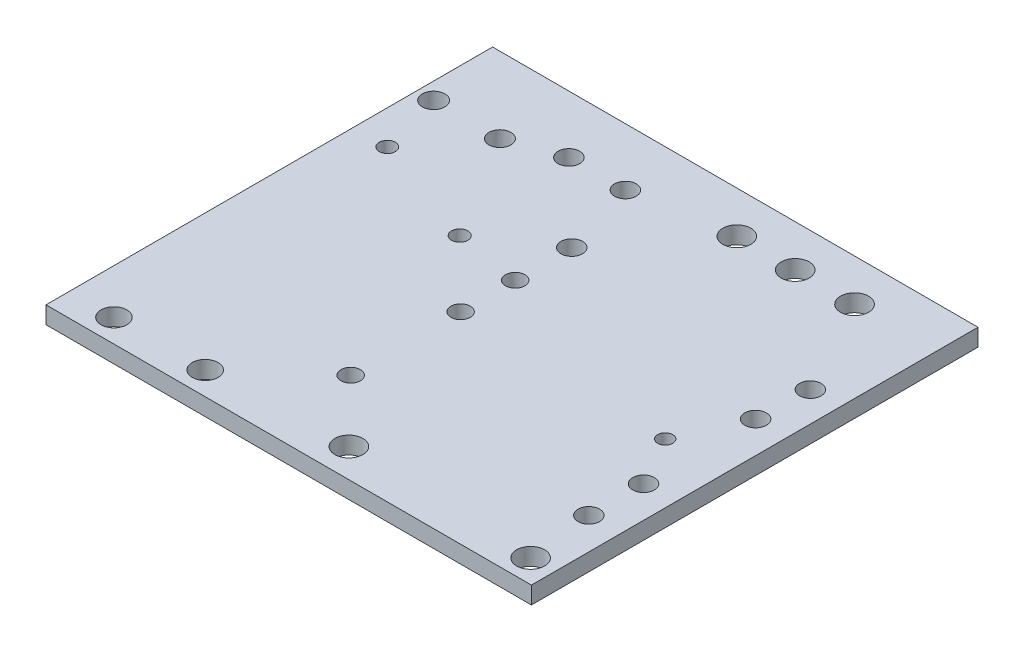
ISO-10303-21;
HEADER;
FILE_DESCRIPTION(('STEP AP214'),'2;1');
FILE_NAME('part.step','',(''),(''),'','','');
FILE_SCHEMA(('AUTOMOTIVE_DESIGN { 1 0 10303 214 1 1 1 1 }'));
ENDSEC;
DATA;
#1=APPLICATION_CONTEXT('core data for automotive mechanical design processes');
#2=APPLICATION_PROTOCOL_DEFINITION('international standard','automotive_design',2000,#1);
#3=PRODUCT_CONTEXT('',#1,'mechanical');
#4=PRODUCT('Part','Part','',(#3));
#5=PRODUCT_RELATED_PRODUCT_CATEGORY('part','',(#4));
#6=PRODUCT_DEFINITION_FORMATION('','',#4);
#7=PRODUCT_DEFINITION_CONTEXT('part definition',#1,'design');
#8=PRODUCT_DEFINITION('design','',#6,#7);
#9=PRODUCT_DEFINITION_SHAPE('','',#8);
#10=(LENGTH_UNIT() NAMED_UNIT(*) SI_UNIT(.MILLI.,.METRE.));
#11=(NAMED_UNIT(*) PLANE_ANGLE_UNIT() SI_UNIT($,.RADIAN.));
#12=(NAMED_UNIT(*) SI_UNIT($,.STERADIAN.) SOLID_ANGLE_UNIT());
#13=UNCERTAINTY_MEASURE_WITH_UNIT(LENGTH_MEASURE(1.E-05),#10,'distance_accuracy_value','');
#14=(GEOMETRIC_REPRESENTATION_CONTEXT(3) GLOBAL_UNCERTAINTY_ASSIGNED_CONTEXT((#13)) GLOBAL_UNIT_ASSIGNED_CONTEXT((#10,
#11,#12)) REPRESENTATION_CONTEXT('',''));
#15=CARTESIAN_POINT('',(0.,0.,0.));
#16=DIRECTION('',(0.,0.,1.));
#17=DIRECTION('',(1.,0.,0.));
#18=AXIS2_PLACEMENT_3D('',#15,#16,#17);
#19=CARTESIAN_POINT('',(11.25,0.8,10.35));
#20=DIRECTION('',(-1.,0.,0.));
#21=DIRECTION('',(0.,0.,1.));
#22=AXIS2_PLACEMENT_3D('',#19,#20,#21);
#23=PLANE('',#22);
#24=DIRECTION('',(0.,0.,-1.));
#25=VECTOR('',#24,1.);
#26=CARTESIAN_POINT('',(11.25,0.,10.35));
#27=LINE('',#26,#25);
#28=CARTESIAN_POINT('',(11.25,0.,10.35));
#29=VERTEX_POINT('',#28);
#30=CARTESIAN_POINT('',(11.25,0.,-10.35));
#31=VERTEX_POINT('',#30);
#32=EDGE_CURVE('E102',#29,#31,#27,.T.);
#33=ORIENTED_EDGE('',*,*,#32,.T.);
#34=DIRECTION('',(0.,-1.,0.));
#35=VECTOR('',#34,1.);
#36=CARTESIAN_POINT('',(11.25,0.8,-10.35));
#37=LINE('',#36,#35);
#38=CARTESIAN_POINT('',(11.25,0.8,-10.35));
#39=VERTEX_POINT('',#38);
#40=EDGE_CURVE('E11',#39,#31,#37,.T.);
#41=ORIENTED_EDGE('',*,*,#40,.F.);
#42=DIRECTION('',(0.,0.,-1.));
#43=VECTOR('',#42,1.);
#44=CARTESIAN_POINT('',(11.25,0.8,10.35));
#45=LINE('',#44,#43);
#46=CARTESIAN_POINT('',(11.25,0.8,10.35));
#47=VERTEX_POINT('',#46);
#48=EDGE_CURVE('E89',#47,#39,#45,.T.);
#49=ORIENTED_EDGE('',*,*,#48,.F.);
#50=DIRECTION('',(0.,-1.,0.));
#51=VECTOR('',#50,1.);
#52=CARTESIAN_POINT('',(11.25,0.8,10.35));
#53=LINE('',#52,#51);
#54=EDGE_CURVE('E98',#47,#29,#53,.T.);
#55=ORIENTED_EDGE('',*,*,#54,.T.);
#56=EDGE_LOOP('',(#33,#41,#49,#55));
#57=FACE_BOUND('',#56,.T.);
#58=ADVANCED_FACE('F36',(#57),#23,.F.);
#59=CARTESIAN_POINT('',(-11.25,0.8,-10.35));
#60=DIRECTION('',(0.,0.,1.));
#61=DIRECTION('',(1.,0.,0.));
#62=AXIS2_PLACEMENT_3D('',#59,#60,#61);
#63=PLANE('',#62);
#64=DIRECTION('',(-1.,0.,0.));
#65=VECTOR('',#64,1.);
#66=CARTESIAN_POINT('',(-11.25,0.,-10.35));
#67=LINE('',#66,#65);
#68=CARTESIAN_POINT('',(-11.25,0.,-10.35));
#69=VERTEX_POINT('',#68);
#70=EDGE_CURVE('E93',#31,#69,#67,.T.);
#71=ORIENTED_EDGE('',*,*,#70,.T.);
#72=DIRECTION('',(0.,-1.,0.));
#73=VECTOR('',#72,1.);
#74=CARTESIAN_POINT('',(-11.25,0.8,-10.35));
#75=LINE('',#74,#73);
#76=CARTESIAN_POINT('',(-11.25,0.8,-10.35));
#77=VERTEX_POINT('',#76);
#78=EDGE_CURVE('E45',#77,#69,#75,.T.);
#79=ORIENTED_EDGE('',*,*,#78,.F.);
#80=DIRECTION('',(-1.,0.,0.));
#81=VECTOR('',#80,1.);
#82=CARTESIAN_POINT('',(-11.25,0.8,-10.35));
#83=LINE('',#82,#81);
#84=EDGE_CURVE('E84',#39,#77,#83,.T.);
#85=ORIENTED_EDGE('',*,*,#84,.F.);
#86=ORIENTED_EDGE('',*,*,#40,.T.);
#87=EDGE_LOOP('',(#71,#79,#85,#86));
#88=FACE_BOUND('',#87,.T.);
#89=ADVANCED_FACE('F92',(#88),#63,.F.);
#90=CARTESIAN_POINT('',(-11.25,0.8,10.35));
#91=DIRECTION('',(1.,0.,0.));
#92=DIRECTION('',(0.,0.,-1.));
#93=AXIS2_PLACEMENT_3D('',#90,#91,#92);
#94=PLANE('',#93);
#95=DIRECTION('',(0.,0.,1.));
#96=VECTOR('',#95,1.);
#97=CARTESIAN_POINT('',(-11.25,0.,10.35));
#98=LINE('',#97,#96);
#99=CARTESIAN_POINT('',(-11.25,0.,10.35));
#100=VERTEX_POINT('',#99);
#101=EDGE_CURVE('E71',#69,#100,#98,.T.);
#102=ORIENTED_EDGE('',*,*,#101,.T.);
#103=DIRECTION('',(0.,-1.,0.));
#104=VECTOR('',#103,1.);
#105=CARTESIAN_POINT('',(-11.25,0.8,10.35));
#106=LINE('',#105,#104);
#107=CARTESIAN_POINT('',(-11.25,0.8,10.35));
#108=VERTEX_POINT('',#107);
#109=EDGE_CURVE('E94',#108,#100,#106,.T.);
#110=ORIENTED_EDGE('',*,*,#109,.F.);
#111=DIRECTION('',(0.,0.,1.));
#112=VECTOR('',#111,1.);
#113=CARTESIAN_POINT('',(-11.25,0.8,10.35));
#114=LINE('',#113,#112);
#115=EDGE_CURVE('E87',#77,#108,#114,.T.);
#116=ORIENTED_EDGE('',*,*,#115,.F.);
#117=ORIENTED_EDGE('',*,*,#78,.T.);
#118=EDGE_LOOP('',(#102,#110,#116,#117));
#119=FACE_BOUND('',#118,.T.);
#120=ADVANCED_FACE('F96',(#119),#94,.F.);
#121=CARTESIAN_POINT('',(-11.25,0.8,10.35));
#122=DIRECTION('',(0.,0.,-1.));
#123=DIRECTION('',(-1.,0.,0.));
#124=AXIS2_PLACEMENT_3D('',#121,#122,#123);
#125=PLANE('',#124);
#126=DIRECTION('',(1.,0.,0.));
#127=VECTOR('',#126,1.);
#128=CARTESIAN_POINT('',(-11.25,0.,10.35));
#129=LINE('',#128,#127);
#130=EDGE_CURVE('E77',#100,#29,#129,.T.);
#131=ORIENTED_EDGE('',*,*,#130,.T.);
#132=ORIENTED_EDGE('',*,*,#54,.F.);
#133=DIRECTION('',(1.,0.,0.));
#134=VECTOR('',#133,1.);
#135=CARTESIAN_POINT('',(-11.25,0.8,10.35));
#136=LINE('',#135,#134);
#137=EDGE_CURVE('E54',#108,#47,#136,.T.);
#138=ORIENTED_EDGE('',*,*,#137,.F.);
#139=ORIENTED_EDGE('',*,*,#109,.T.);
#140=EDGE_LOOP('',(#131,#132,#138,#139));
#141=FACE_BOUND('',#140,.T.);
#142=ADVANCED_FACE('F247',(#141),#125,.F.);
#143=CARTESIAN_POINT('',(11.25,0.8,-10.35));
#144=DIRECTION('',(0.,-1.,0.));
#145=DIRECTION('',(0.,0.,-1.));
#146=AXIS2_PLACEMENT_3D('',#143,#144,#145);
#147=PLANE('',#146);
#148=CARTESIAN_POINT('',(-10.4732064370183,0.8,-6.84022388522041));
#149=DIRECTION('',(0.,1.,0.));
#150=DIRECTION('',(0.,0.,1.));
#151=AXIS2_PLACEMENT_3D('',#148,#149,#150);
#152=CIRCLE('',#151,0.522974081322831);
#153=CARTESIAN_POINT('',(-10.4732064370183,0.8,-6.31724980389758));
#154=VERTEX_POINT('',#153);
#155=EDGE_CURVE('E201',#154,#154,#152,.T.);
#156=ORIENTED_EDGE('',*,*,#155,.F.);
#157=EDGE_LOOP('',(#156));
#158=FACE_BOUND('',#157,.T.);
#159=CARTESIAN_POINT('',(8.4856740845613,0.8,1.38409855189605));
#160=DIRECTION('',(0.,1.,0.));
#161=DIRECTION('',(0.,0.,1.));
#162=AXIS2_PLACEMENT_3D('',#159,#160,#161);
#163=CIRCLE('',#162,0.350015613233293);
#164=CARTESIAN_POINT('',(8.4856740845613,0.8,1.73411416512934));
#165=VERTEX_POINT('',#164);
#166=EDGE_CURVE('E191',#165,#165,#163,.T.);
#167=ORIENTED_EDGE('',*,*,#166,.F.);
#168=EDGE_LOOP('',(#167));
#169=FACE_BOUND('',#168,.T.);
#170=CARTESIAN_POINT('',(-4.44144338362008,0.8,-2.0176093511858));
#171=DIRECTION('',(0.,1.,0.));
#172=DIRECTION('',(0.,0.,1.));
#173=AXIS2_PLACEMENT_3D('',#170,#171,#172);
#174=CIRCLE('',#173,0.378805018342111);
#175=CARTESIAN_POINT('',(-4.44144338362008,0.8,-1.63880433284368));
#176=VERTEX_POINT('',#175);
#177=EDGE_CURVE('E188',#176,#176,#174,.T.);
#178=ORIENTED_EDGE('',*,*,#177,.F.);
#179=EDGE_LOOP('',(#178));
#180=FACE_BOUND('',#179,.T.);
#181=CARTESIAN_POINT('',(-9.67793946449817,0.8,-3.89695244413638));
#182=DIRECTION('',(0.,1.,0.));
#183=DIRECTION('',(0.,0.,1.));
#184=AXIS2_PLACEMENT_3D('',#181,#182,#183);
#185=CIRCLE('',#184,0.375708804748963);
#186=CARTESIAN_POINT('',(-9.67793946449817,0.8,-3.52124363938742));
#187=VERTEX_POINT('',#186);
#188=EDGE_CURVE('E185',#187,#187,#185,.T.);
#189=ORIENTED_EDGE('',*,*,#188,.F.);
#190=EDGE_LOOP('',(#189));
#191=FACE_BOUND('',#190,.T.);
#192=CARTESIAN_POINT('',(-4.94565562891905,0.8,9.27688136240454));
#193=DIRECTION('',(0.,1.,0.));
#194=DIRECTION('',(0.,0.,1.));
#195=AXIS2_PLACEMENT_3D('',#192,#193,#194);
#196=CIRCLE('',#195,0.6);
#197=CARTESIAN_POINT('',(-4.94565562891905,0.8,9.87688136240454));
#198=VERTEX_POINT('',#197);
#199=EDGE_CURVE('E181',#198,#198,#196,.T.);
#200=ORIENTED_EDGE('',*,*,#199,.F.);
#201=EDGE_LOOP('',(#200));
#202=FACE_BOUND('',#201,.T.);
#203=CARTESIAN_POINT('',(-9.17319454829377,0.8,9.27688136240454));
#204=DIRECTION('',(0.,1.,0.));
#205=DIRECTION('',(0.,0.,1.));
#206=AXIS2_PLACEMENT_3D('',#203,#204,#205);
#207=CIRCLE('',#206,0.6);
#208=CARTESIAN_POINT('',(-9.17319454829377,0.8,9.87688136240454));
#209=VERTEX_POINT('',#208);
#210=EDGE_CURVE('E177',#209,#209,#207,.T.);
#211=ORIENTED_EDGE('',*,*,#210,.F.);
#212=EDGE_LOOP('',(#211));
#213=FACE_BOUND('',#212,.T.);
#214=CARTESIAN_POINT('',(-7.40057526025794,0.8,-6.84022388522041));
#215=DIRECTION('',(0.,1.,0.));
#216=DIRECTION('',(0.,0.,1.));
#217=AXIS2_PLACEMENT_3D('',#214,#215,#216);
#218=CIRCLE('',#217,0.507049463910012);
#219=CARTESIAN_POINT('',(-7.40057526025794,0.8,-6.3331744213104));
#220=VERTEX_POINT('',#219);
#221=EDGE_CURVE('E173',#220,#220,#218,.T.);
#222=ORIENTED_EDGE('',*,*,#221,.F.);
#223=EDGE_LOOP('',(#222));
#224=FACE_BOUND('',#223,.T.);
#225=CARTESIAN_POINT('',(7.46451211684841,0.8,-8.41282710997643));
#226=DIRECTION('',(0.,1.,0.));
#227=DIRECTION('',(0.,0.,1.));
#228=AXIS2_PLACEMENT_3D('',#225,#226,#227);
#229=CIRCLE('',#228,0.65);
#230=CARTESIAN_POINT('',(7.46451211684841,0.8,-7.76282710997643));
#231=VERTEX_POINT('',#230);
#232=EDGE_CURVE('E169',#231,#231,#229,.T.);
#233=ORIENTED_EDGE('',*,*,#232,.F.);
#234=EDGE_LOOP('',(#233));
#235=FACE_BOUND('',#234,.T.);
#236=CARTESIAN_POINT('',(4.71344683180445,0.8,-8.41282710997643));
#237=DIRECTION('',(0.,1.,0.));
#238=DIRECTION('',(0.,0.,1.));
#239=AXIS2_PLACEMENT_3D('',#236,#237,#238);
#240=CIRCLE('',#239,0.65);
#241=CARTESIAN_POINT('',(4.71344683180445,0.8,-7.76282710997643));
#242=VERTEX_POINT('',#241);
#243=EDGE_CURVE('E165',#242,#242,#240,.T.);
#244=ORIENTED_EDGE('',*,*,#243,.F.);
#245=EDGE_LOOP('',(#244));
#246=FACE_BOUND('',#245,.T.);
#247=CARTESIAN_POINT('',(2.00981370684746,0.8,-8.41282710997643));
#248=DIRECTION('',(0.,1.,0.));
#249=DIRECTION('',(0.,0.,1.));
#250=AXIS2_PLACEMENT_3D('',#247,#248,#249);
#251=CIRCLE('',#250,0.65);
#252=CARTESIAN_POINT('',(2.00981370684746,0.8,-7.76282710997643));
#253=VERTEX_POINT('',#252);
#254=EDGE_CURVE('E161',#253,#253,#251,.T.);
#255=ORIENTED_EDGE('',*,*,#254,.F.);
#256=EDGE_LOOP('',(#255));
#257=FACE_BOUND('',#256,.T.);
#258=CARTESIAN_POINT('',(-1.36249742269812,0.8,1.01875027100488));
#259=DIRECTION('',(0.,1.,0.));
#260=DIRECTION('',(0.,0.,1.));
#261=AXIS2_PLACEMENT_3D('',#258,#259,#260);
#262=CIRCLE('',#261,0.45);
#263=CARTESIAN_POINT('',(-1.36249742269812,0.8,1.46875027100488));
#264=VERTEX_POINT('',#263);
#265=EDGE_CURVE('E157',#264,#264,#262,.T.);
#266=ORIENTED_EDGE('',*,*,#265,.F.);
#267=EDGE_LOOP('',(#266));
#268=FACE_BOUND('',#267,.T.);
#269=CARTESIAN_POINT('',(-1.36249742269812,0.8,-1.51017465891394));
#270=DIRECTION('',(0.,1.,0.));
#271=DIRECTION('',(0.,0.,1.));
#272=AXIS2_PLACEMENT_3D('',#269,#270,#271);
#273=CIRCLE('',#272,0.45);
#274=CARTESIAN_POINT('',(-1.36249742269812,0.8,-1.06017465891394));
#275=VERTEX_POINT('',#274);
#276=EDGE_CURVE('E153',#275,#275,#273,.T.);
#277=ORIENTED_EDGE('',*,*,#276,.F.);
#278=EDGE_LOOP('',(#277));
#279=FACE_BOUND('',#278,.T.);
#280=CARTESIAN_POINT('',(9.86830054840113,0.8,-3.96095459609984));
#281=DIRECTION('',(0.,1.,0.));
#282=DIRECTION('',(0.,0.,1.));
#283=AXIS2_PLACEMENT_3D('',#280,#281,#282);
#284=CIRCLE('',#283,0.500000000000001);
#285=CARTESIAN_POINT('',(9.86830054840113,0.8,-3.46095459609984));
#286=VERTEX_POINT('',#285);
#287=EDGE_CURVE('E149',#286,#286,#284,.T.);
#288=ORIENTED_EDGE('',*,*,#287,.F.);
#289=EDGE_LOOP('',(#288));
#290=FACE_BOUND('',#289,.T.);
#291=CARTESIAN_POINT('',(-1.36249742269812,0.8,6.11397672923984));
#292=DIRECTION('',(0.,1.,0.));
#293=DIRECTION('',(0.,0.,1.));
#294=AXIS2_PLACEMENT_3D('',#291,#292,#293);
#295=CIRCLE('',#294,0.45);
#296=CARTESIAN_POINT('',(-1.36249742269812,0.8,6.56397672923984));
#297=VERTEX_POINT('',#296);
#298=EDGE_CURVE('E145',#297,#297,#295,.T.);
#299=ORIENTED_EDGE('',*,*,#298,.F.);
#300=EDGE_LOOP('',(#299));
#301=FACE_BOUND('',#300,.T.);
#302=CARTESIAN_POINT('',(-2.42991794487146,0.8,-7.68432392844592));
#303=DIRECTION('',(0.,1.,0.));
#304=DIRECTION('',(0.,0.,1.));
#305=AXIS2_PLACEMENT_3D('',#302,#303,#304);
#306=CIRCLE('',#305,0.500000000000001);
#307=CARTESIAN_POINT('',(-2.42991794487146,0.8,-7.18432392844592));
#308=VERTEX_POINT('',#307);
#309=EDGE_CURVE('E141',#308,#308,#306,.T.);
#310=ORIENTED_EDGE('',*,*,#309,.F.);
#311=EDGE_LOOP('',(#310));
#312=FACE_BOUND('',#311,.T.);
#313=CARTESIAN_POINT('',(-5.04905004636665,0.8,-7.68432392844592));
#314=DIRECTION('',(0.,1.,0.));
#315=DIRECTION('',(0.,0.,1.));
#316=AXIS2_PLACEMENT_3D('',#313,#314,#315);
#317=CIRCLE('',#316,0.500000000000001);
#318=CARTESIAN_POINT('',(-5.04905004636665,0.8,-7.18432392844592));
#319=VERTEX_POINT('',#318);
#320=EDGE_CURVE('E137',#319,#319,#317,.T.);
#321=ORIENTED_EDGE('',*,*,#320,.F.);
#322=EDGE_LOOP('',(#321));
#323=FACE_BOUND('',#322,.T.);
#324=CARTESIAN_POINT('',(1.45647824505554,0.8,9.01844096568845));
#325=DIRECTION('',(0.,1.,0.));
#326=DIRECTION('',(0.,0.,1.));
#327=AXIS2_PLACEMENT_3D('',#324,#325,#326);
#328=CIRCLE('',#327,0.65);
#329=CARTESIAN_POINT('',(1.45647824505554,0.8,9.66844096568845));
#330=VERTEX_POINT('',#329);
#331=EDGE_CURVE('E133',#330,#330,#328,.T.);
#332=ORIENTED_EDGE('',*,*,#331,.F.);
#333=EDGE_LOOP('',(#332));
#334=FACE_BOUND('',#333,.T.);
#335=CARTESIAN_POINT('',(10.140573186622,0.8,9.27688136240454));
#336=DIRECTION('',(0.,1.,0.));
#337=DIRECTION('',(0.,0.,1.));
#338=AXIS2_PLACEMENT_3D('',#335,#336,#337);
#339=CIRCLE('',#338,0.649999999999999);
#340=CARTESIAN_POINT('',(10.140573186622,0.8,9.92688136240454));
#341=VERTEX_POINT('',#340);
#342=EDGE_CURVE('E129',#341,#341,#339,.T.);
#343=ORIENTED_EDGE('',*,*,#342,.F.);
#344=EDGE_LOOP('',(#343));
#345=FACE_BOUND('',#344,.T.);
#346=CARTESIAN_POINT('',(9.7819644312939,0.8,6.22038171359918));
#347=DIRECTION('',(0.,1.,0.));
#348=DIRECTION('',(0.,0.,1.));
#349=AXIS2_PLACEMENT_3D('',#346,#347,#348);
#350=CIRCLE('',#349,0.500000000000001);
#351=CARTESIAN_POINT('',(9.7819644312939,0.8,6.72038171359918));
#352=VERTEX_POINT('',#351);
#353=EDGE_CURVE('E125',#352,#352,#350,.T.);
#354=ORIENTED_EDGE('',*,*,#353,.F.);
#355=EDGE_LOOP('',(#354));
#356=FACE_BOUND('',#355,.T.);
#357=CARTESIAN_POINT('',(9.7819644312939,0.8,3.68441086293057));
#358=DIRECTION('',(0.,1.,0.));
#359=DIRECTION('',(0.,0.,1.));
#360=AXIS2_PLACEMENT_3D('',#357,#358,#359);
#361=CIRCLE('',#360,0.500000000000001);
#362=CARTESIAN_POINT('',(9.7819644312939,0.8,4.18441086293057));
#363=VERTEX_POINT('',#362);
#364=EDGE_CURVE('E121',#363,#363,#361,.T.);
#365=ORIENTED_EDGE('',*,*,#364,.F.);
#366=EDGE_LOOP('',(#365));
#367=FACE_BOUND('',#366,.T.);
#368=CARTESIAN_POINT('',(9.7819644312939,0.8,-1.51017465891394));
#369=DIRECTION('',(0.,1.,0.));
#370=DIRECTION('',(0.,0.,1.));
#371=AXIS2_PLACEMENT_3D('',#368,#369,#370);
#372=CIRCLE('',#371,0.500000000000001);
#373=CARTESIAN_POINT('',(9.7819644312939,0.8,-1.01017465891394));
#374=VERTEX_POINT('',#373);
#375=EDGE_CURVE('E117',#374,#374,#372,.T.);
#376=ORIENTED_EDGE('',*,*,#375,.F.);
#377=EDGE_LOOP('',(#376));
#378=FACE_BOUND('',#377,.T.);
#379=CARTESIAN_POINT('',(-1.36249742269812,0.8,-4.13217588978839));
#380=DIRECTION('',(0.,1.,0.));
#381=DIRECTION('',(0.,0.,1.));
#382=AXIS2_PLACEMENT_3D('',#379,#380,#381);
#383=CIRCLE('',#382,0.500000000000001);
#384=CARTESIAN_POINT('',(-1.36249742269812,0.8,-3.63217588978839));
#385=VERTEX_POINT('',#384);
#386=EDGE_CURVE('E113',#385,#385,#383,.T.);
#387=ORIENTED_EDGE('',*,*,#386,.F.);
#388=EDGE_LOOP('',(#387));
#389=FACE_BOUND('',#388,.T.);
#390=ORIENTED_EDGE('',*,*,#48,.T.);
#391=ORIENTED_EDGE('',*,*,#84,.T.);
#392=ORIENTED_EDGE('',*,*,#115,.T.);
#393=ORIENTED_EDGE('',*,*,#137,.T.);
#394=EDGE_LOOP('',(#390,#391,#392,#393));
#395=FACE_BOUND('',#394,.T.);
#396=ADVANCED_FACE('F85',(#158,#169,#180,#191,#202,#213,#224,#235,#246,#257,#268,#279,#290,#301,
#312,#323,#334,#345,#356,#367,#378,#389,#395),#147,.F.);
#397=CARTESIAN_POINT('',(11.25,0.,-10.35));
#398=DIRECTION('',(0.,-1.,0.));
#399=DIRECTION('',(0.,0.,-1.));
#400=AXIS2_PLACEMENT_3D('',#397,#398,#399);
#401=PLANE('',#400);
#402=CARTESIAN_POINT('',(-10.4732064370183,0.,-6.84022388522041));
#403=DIRECTION('',(0.,-1.,0.));
#404=DIRECTION('',(0.,0.,-1.));
#405=AXIS2_PLACEMENT_3D('',#402,#403,#404);
#406=CIRCLE('',#405,0.522974081322831);
#407=CARTESIAN_POINT('',(-10.4732064370183,0.,-7.36319796654324));
#408=VERTEX_POINT('',#407);
#409=EDGE_CURVE('E39',#408,#408,#406,.T.);
#410=ORIENTED_EDGE('',*,*,#409,.F.);
#411=EDGE_LOOP('',(#410));
#412=FACE_BOUND('',#411,.T.);
#413=CARTESIAN_POINT('',(8.4856740845613,0.,1.38409855189605));
#414=DIRECTION('',(0.,-1.,0.));
#415=DIRECTION('',(0.,0.,-1.));
#416=AXIS2_PLACEMENT_3D('',#413,#414,#415);
#417=CIRCLE('',#416,0.350015613233293);
#418=CARTESIAN_POINT('',(8.4856740845613,0.,1.03408293866276));
#419=VERTEX_POINT('',#418);
#420=EDGE_CURVE('E189',#419,#419,#417,.T.);
#421=ORIENTED_EDGE('',*,*,#420,.F.);
#422=EDGE_LOOP('',(#421));
#423=FACE_BOUND('',#422,.T.);
#424=CARTESIAN_POINT('',(-4.44144338362008,0.,-2.0176093511858));
#425=DIRECTION('',(0.,-1.,0.));
#426=DIRECTION('',(0.,0.,-1.));
#427=AXIS2_PLACEMENT_3D('',#424,#425,#426);
#428=CIRCLE('',#427,0.378805018342111);
#429=CARTESIAN_POINT('',(-4.44144338362008,0.,-2.39641436952791));
#430=VERTEX_POINT('',#429);
#431=EDGE_CURVE('E186',#430,#430,#428,.T.);
#432=ORIENTED_EDGE('',*,*,#431,.F.);
#433=EDGE_LOOP('',(#432));
#434=FACE_BOUND('',#433,.T.);
#435=CARTESIAN_POINT('',(-9.67793946449817,0.,-3.89695244413638));
#436=DIRECTION('',(0.,-1.,0.));
#437=DIRECTION('',(0.,0.,-1.));
#438=AXIS2_PLACEMENT_3D('',#435,#436,#437);
#439=CIRCLE('',#438,0.375708804748963);
#440=CARTESIAN_POINT('',(-9.67793946449817,0.,-4.27266124888535));
#441=VERTEX_POINT('',#440);
#442=EDGE_CURVE('E182',#441,#441,#439,.T.);
#443=ORIENTED_EDGE('',*,*,#442,.F.);
#444=EDGE_LOOP('',(#443));
#445=FACE_BOUND('',#444,.T.);
#446=CARTESIAN_POINT('',(-4.94565562891905,0.,9.27688136240454));
#447=DIRECTION('',(0.,-1.,0.));
#448=DIRECTION('',(0.,0.,-1.));
#449=AXIS2_PLACEMENT_3D('',#446,#447,#448);
#450=CIRCLE('',#449,0.6);
#451=CARTESIAN_POINT('',(-4.94565562891905,0.,8.67688136240455));
#452=VERTEX_POINT('',#451);
#453=EDGE_CURVE('E178',#452,#452,#450,.T.);
#454=ORIENTED_EDGE('',*,*,#453,.F.);
#455=EDGE_LOOP('',(#454));
#456=FACE_BOUND('',#455,.T.);
#457=CARTESIAN_POINT('',(-9.17319454829377,0.,9.27688136240454));
#458=DIRECTION('',(0.,-1.,0.));
#459=DIRECTION('',(0.,0.,-1.));
#460=AXIS2_PLACEMENT_3D('',#457,#458,#459);
#461=CIRCLE('',#460,0.6);
#462=CARTESIAN_POINT('',(-9.17319454829377,0.,8.67688136240455));
#463=VERTEX_POINT('',#462);
#464=EDGE_CURVE('E174',#463,#463,#461,.T.);
#465=ORIENTED_EDGE('',*,*,#464,.F.);
#466=EDGE_LOOP('',(#465));
#467=FACE_BOUND('',#466,.T.);
#468=CARTESIAN_POINT('',(-7.40057526025794,0.,-6.84022388522041));
#469=DIRECTION('',(0.,-1.,0.));
#470=DIRECTION('',(0.,0.,-1.));
#471=AXIS2_PLACEMENT_3D('',#468,#469,#470);
#472=CIRCLE('',#471,0.507049463910012);
#473=CARTESIAN_POINT('',(-7.40057526025794,0.,-7.34727334913042));
#474=VERTEX_POINT('',#473);
#475=EDGE_CURVE('E170',#474,#474,#472,.T.);
#476=ORIENTED_EDGE('',*,*,#475,.F.);
#477=EDGE_LOOP('',(#476));
#478=FACE_BOUND('',#477,.T.);
#479=CARTESIAN_POINT('',(7.46451211684841,0.,-8.41282710997643));
#480=DIRECTION('',(0.,-1.,0.));
#481=DIRECTION('',(0.,0.,-1.));
#482=AXIS2_PLACEMENT_3D('',#479,#480,#481);
#483=CIRCLE('',#482,0.65);
#484=CARTESIAN_POINT('',(7.46451211684841,0.,-9.06282710997643));
#485=VERTEX_POINT('',#484);
#486=EDGE_CURVE('E166',#485,#485,#483,.T.);
#487=ORIENTED_EDGE('',*,*,#486,.F.);
#488=EDGE_LOOP('',(#487));
#489=FACE_BOUND('',#488,.T.);
#490=CARTESIAN_POINT('',(4.71344683180445,0.,-8.41282710997643));
#491=DIRECTION('',(0.,-1.,0.));
#492=DIRECTION('',(0.,0.,-1.));
#493=AXIS2_PLACEMENT_3D('',#490,#491,#492);
#494=CIRCLE('',#493,0.65);
#495=CARTESIAN_POINT('',(4.71344683180445,0.,-9.06282710997643));
#496=VERTEX_POINT('',#495);
#497=EDGE_CURVE('E162',#496,#496,#494,.T.);
#498=ORIENTED_EDGE('',*,*,#497,.F.);
#499=EDGE_LOOP('',(#498));
#500=FACE_BOUND('',#499,.T.);
#501=CARTESIAN_POINT('',(2.00981370684746,0.,-8.41282710997643));
#502=DIRECTION('',(0.,-1.,0.));
#503=DIRECTION('',(0.,0.,-1.));
#504=AXIS2_PLACEMENT_3D('',#501,#502,#503);
#505=CIRCLE('',#504,0.65);
#506=CARTESIAN_POINT('',(2.00981370684746,0.,-9.06282710997643));
#507=VERTEX_POINT('',#506);
#508=EDGE_CURVE('E158',#507,#507,#505,.T.);
#509=ORIENTED_EDGE('',*,*,#508,.F.);
#510=EDGE_LOOP('',(#509));
#511=FACE_BOUND('',#510,.T.);
#512=CARTESIAN_POINT('',(-1.36249742269812,0.,1.01875027100488));
#513=DIRECTION('',(0.,-1.,0.));
#514=DIRECTION('',(0.,0.,-1.));
#515=AXIS2_PLACEMENT_3D('',#512,#513,#514);
#516=CIRCLE('',#515,0.45);
#517=CARTESIAN_POINT('',(-1.36249742269812,0.,0.568750271004883));
#518=VERTEX_POINT('',#517);
#519=EDGE_CURVE('E154',#518,#518,#516,.T.);
#520=ORIENTED_EDGE('',*,*,#519,.F.);
#521=EDGE_LOOP('',(#520));
#522=FACE_BOUND('',#521,.T.);
#523=CARTESIAN_POINT('',(-1.36249742269812,0.,-1.51017465891394));
#524=DIRECTION('',(0.,-1.,0.));
#525=DIRECTION('',(0.,0.,-1.));
#526=AXIS2_PLACEMENT_3D('',#523,#524,#525);
#527=CIRCLE('',#526,0.45);
#528=CARTESIAN_POINT('',(-1.36249742269812,0.,-1.96017465891394));
#529=VERTEX_POINT('',#528);
#530=EDGE_CURVE('E150',#529,#529,#527,.T.);
#531=ORIENTED_EDGE('',*,*,#530,.F.);
#532=EDGE_LOOP('',(#531));
#533=FACE_BOUND('',#532,.T.);
#534=CARTESIAN_POINT('',(9.86830054840113,0.,-3.96095459609984));
#535=DIRECTION('',(0.,-1.,0.));
#536=DIRECTION('',(0.,0.,-1.));
#537=AXIS2_PLACEMENT_3D('',#534,#535,#536);
#538=CIRCLE('',#537,0.500000000000001);
#539=CARTESIAN_POINT('',(9.86830054840113,0.,-4.46095459609984));
#540=VERTEX_POINT('',#539);
#541=EDGE_CURVE('E146',#540,#540,#538,.T.);
#542=ORIENTED_EDGE('',*,*,#541,.F.);
#543=EDGE_LOOP('',(#542));
#544=FACE_BOUND('',#543,.T.);
#545=CARTESIAN_POINT('',(-1.36249742269812,0.,6.11397672923984));
#546=DIRECTION('',(0.,-1.,0.));
#547=DIRECTION('',(0.,0.,-1.));
#548=AXIS2_PLACEMENT_3D('',#545,#546,#547);
#549=CIRCLE('',#548,0.45);
#550=CARTESIAN_POINT('',(-1.36249742269812,0.,5.66397672923984));
#551=VERTEX_POINT('',#550);
#552=EDGE_CURVE('E142',#551,#551,#549,.T.);
#553=ORIENTED_EDGE('',*,*,#552,.F.);
#554=EDGE_LOOP('',(#553));
#555=FACE_BOUND('',#554,.T.);
#556=CARTESIAN_POINT('',(-2.42991794487146,0.,-7.68432392844592));
#557=DIRECTION('',(0.,-1.,0.));
#558=DIRECTION('',(0.,0.,-1.));
#559=AXIS2_PLACEMENT_3D('',#556,#557,#558);
#560=CIRCLE('',#559,0.500000000000001);
#561=CARTESIAN_POINT('',(-2.42991794487146,0.,-8.18432392844592));
#562=VERTEX_POINT('',#561);
#563=EDGE_CURVE('E138',#562,#562,#560,.T.);
#564=ORIENTED_EDGE('',*,*,#563,.F.);
#565=EDGE_LOOP('',(#564));
#566=FACE_BOUND('',#565,.T.);
#567=CARTESIAN_POINT('',(-5.04905004636665,0.,-7.68432392844592));
#568=DIRECTION('',(0.,-1.,0.));
#569=DIRECTION('',(0.,0.,-1.));
#570=AXIS2_PLACEMENT_3D('',#567,#568,#569);
#571=CIRCLE('',#570,0.500000000000001);
#572=CARTESIAN_POINT('',(-5.04905004636665,0.,-8.18432392844592));
#573=VERTEX_POINT('',#572);
#574=EDGE_CURVE('E134',#573,#573,#571,.T.);
#575=ORIENTED_EDGE('',*,*,#574,.F.);
#576=EDGE_LOOP('',(#575));
#577=FACE_BOUND('',#576,.T.);
#578=CARTESIAN_POINT('',(1.45647824505554,0.,9.01844096568845));
#579=DIRECTION('',(0.,-1.,0.));
#580=DIRECTION('',(0.,0.,-1.));
#581=AXIS2_PLACEMENT_3D('',#578,#579,#580);
#582=CIRCLE('',#581,0.65);
#583=CARTESIAN_POINT('',(1.45647824505554,0.,8.36844096568845));
#584=VERTEX_POINT('',#583);
#585=EDGE_CURVE('E130',#584,#584,#582,.T.);
#586=ORIENTED_EDGE('',*,*,#585,.F.);
#587=EDGE_LOOP('',(#586));
#588=FACE_BOUND('',#587,.T.);
#589=CARTESIAN_POINT('',(10.140573186622,0.,9.27688136240454));
#590=DIRECTION('',(0.,-1.,0.));
#591=DIRECTION('',(0.,0.,-1.));
#592=AXIS2_PLACEMENT_3D('',#589,#590,#591);
#593=CIRCLE('',#592,0.649999999999999);
#594=CARTESIAN_POINT('',(10.140573186622,0.,8.62688136240454));
#595=VERTEX_POINT('',#594);
#596=EDGE_CURVE('E126',#595,#595,#593,.T.);
#597=ORIENTED_EDGE('',*,*,#596,.F.);
#598=EDGE_LOOP('',(#597));
#599=FACE_BOUND('',#598,.T.);
#600=CARTESIAN_POINT('',(9.7819644312939,0.,6.22038171359918));
#601=DIRECTION('',(0.,-1.,0.));
#602=DIRECTION('',(0.,0.,-1.));
#603=AXIS2_PLACEMENT_3D('',#600,#601,#602);
#604=CIRCLE('',#603,0.500000000000001);
#605=CARTESIAN_POINT('',(9.7819644312939,0.,5.72038171359918));
#606=VERTEX_POINT('',#605);
#607=EDGE_CURVE('E122',#606,#606,#604,.T.);
#608=ORIENTED_EDGE('',*,*,#607,.F.);
#609=EDGE_LOOP('',(#608));
#610=FACE_BOUND('',#609,.T.);
#611=CARTESIAN_POINT('',(9.7819644312939,0.,3.68441086293057));
#612=DIRECTION('',(0.,-1.,0.));
#613=DIRECTION('',(0.,0.,-1.));
#614=AXIS2_PLACEMENT_3D('',#611,#612,#613);
#615=CIRCLE('',#614,0.500000000000001);
#616=CARTESIAN_POINT('',(9.7819644312939,0.,3.18441086293057));
#617=VERTEX_POINT('',#616);
#618=EDGE_CURVE('E118',#617,#617,#615,.T.);
#619=ORIENTED_EDGE('',*,*,#618,.F.);
#620=EDGE_LOOP('',(#619));
#621=FACE_BOUND('',#620,.T.);
#622=CARTESIAN_POINT('',(9.7819644312939,0.,-1.51017465891394));
#623=DIRECTION('',(0.,-1.,0.));
#624=DIRECTION('',(0.,0.,-1.));
#625=AXIS2_PLACEMENT_3D('',#622,#623,#624);
#626=CIRCLE('',#625,0.500000000000001);
#627=CARTESIAN_POINT('',(9.7819644312939,0.,-2.01017465891394));
#628=VERTEX_POINT('',#627);
#629=EDGE_CURVE('E114',#628,#628,#626,.T.);
#630=ORIENTED_EDGE('',*,*,#629,.F.);
#631=EDGE_LOOP('',(#630));
#632=FACE_BOUND('',#631,.T.);
#633=CARTESIAN_POINT('',(-1.36249742269812,0.,-4.13217588978839));
#634=DIRECTION('',(0.,-1.,0.));
#635=DIRECTION('',(0.,0.,-1.));
#636=AXIS2_PLACEMENT_3D('',#633,#634,#635);
#637=CIRCLE('',#636,0.500000000000001);
#638=CARTESIAN_POINT('',(-1.36249742269812,0.,-4.63217588978839));
#639=VERTEX_POINT('',#638);
#640=EDGE_CURVE('E105',#639,#639,#637,.T.);
#641=ORIENTED_EDGE('',*,*,#640,.F.);
#642=EDGE_LOOP('',(#641));
#643=FACE_BOUND('',#642,.T.);
#644=ORIENTED_EDGE('',*,*,#32,.F.);
#645=ORIENTED_EDGE('',*,*,#130,.F.);
#646=ORIENTED_EDGE('',*,*,#101,.F.);
#647=ORIENTED_EDGE('',*,*,#70,.F.);
#648=EDGE_LOOP('',(#644,#645,#646,#647));
#649=FACE_BOUND('',#648,.T.);
#650=ADVANCED_FACE('F246',(#412,#423,#434,#445,#456,#467,#478,#489,#500,#511,#522,#533,#544,
#555,#566,#577,#588,#599,#610,#621,#632,#643,#649),#401,.T.);
#651=CARTESIAN_POINT('',(-1.36249742269812,-1.2,-4.13217588978839));
#652=DIRECTION('',(0.,1.,0.));
#653=DIRECTION('',(0.,0.,1.));
#654=AXIS2_PLACEMENT_3D('',#651,#652,#653);
#655=CYLINDRICAL_SURFACE('',#654,0.500000000000001);
#656=ORIENTED_EDGE('',*,*,#640,.T.);
#657=EDGE_LOOP('',(#656));
#658=FACE_BOUND('',#657,.T.);
#659=ORIENTED_EDGE('',*,*,#386,.T.);
#660=EDGE_LOOP('',(#659));
#661=FACE_BOUND('',#660,.T.);
#662=ADVANCED_FACE('F243',(#658,#661),#655,.F.);
#663=CARTESIAN_POINT('',(9.7819644312939,-1.2,-1.51017465891394));
#664=DIRECTION('',(0.,1.,0.));
#665=DIRECTION('',(0.,0.,1.));
#666=AXIS2_PLACEMENT_3D('',#663,#664,#665);
#667=CYLINDRICAL_SURFACE('',#666,0.500000000000001);
#668=ORIENTED_EDGE('',*,*,#629,.T.);
#669=EDGE_LOOP('',(#668));
#670=FACE_BOUND('',#669,.T.);
#671=ORIENTED_EDGE('',*,*,#375,.T.);
#672=EDGE_LOOP('',(#671));
#673=FACE_BOUND('',#672,.T.);
#674=ADVANCED_FACE('F299',(#670,#673),#667,.F.);
#675=CARTESIAN_POINT('',(9.7819644312939,-1.2,3.68441086293057));
#676=DIRECTION('',(0.,1.,0.));
#677=DIRECTION('',(0.,0.,1.));
#678=AXIS2_PLACEMENT_3D('',#675,#676,#677);
#679=CYLINDRICAL_SURFACE('',#678,0.500000000000001);
#680=ORIENTED_EDGE('',*,*,#618,.T.);
#681=EDGE_LOOP('',(#680));
#682=FACE_BOUND('',#681,.T.);
#683=ORIENTED_EDGE('',*,*,#364,.T.);
#684=EDGE_LOOP('',(#683));
#685=FACE_BOUND('',#684,.T.);
#686=ADVANCED_FACE('F308',(#682,#685),#679,.F.);
#687=CARTESIAN_POINT('',(9.7819644312939,-1.2,6.22038171359918));
#688=DIRECTION('',(0.,1.,0.));
#689=DIRECTION('',(0.,0.,1.));
#690=AXIS2_PLACEMENT_3D('',#687,#688,#689);
#691=CYLINDRICAL_SURFACE('',#690,0.500000000000001);
#692=ORIENTED_EDGE('',*,*,#607,.T.);
#693=EDGE_LOOP('',(#692));
#694=FACE_BOUND('',#693,.T.);
#695=ORIENTED_EDGE('',*,*,#353,.T.);
#696=EDGE_LOOP('',(#695));
#697=FACE_BOUND('',#696,.T.);
#698=ADVANCED_FACE('F318',(#694,#697),#691,.F.);
#699=CARTESIAN_POINT('',(10.140573186622,-1.2,9.27688136240454));
#700=DIRECTION('',(0.,1.,0.));
#701=DIRECTION('',(0.,0.,1.));
#702=AXIS2_PLACEMENT_3D('',#699,#700,#701);
#703=CYLINDRICAL_SURFACE('',#702,0.649999999999999);
#704=ORIENTED_EDGE('',*,*,#596,.T.);
#705=EDGE_LOOP('',(#704));
#706=FACE_BOUND('',#705,.T.);
#707=ORIENTED_EDGE('',*,*,#342,.T.);
#708=EDGE_LOOP('',(#707));
#709=FACE_BOUND('',#708,.T.);
#710=ADVANCED_FACE('F328',(#706,#709),#703,.F.);
#711=CARTESIAN_POINT('',(1.45647824505554,-1.2,9.01844096568845));
#712=DIRECTION('',(0.,1.,0.));
#713=DIRECTION('',(0.,0.,1.));
#714=AXIS2_PLACEMENT_3D('',#711,#712,#713);
#715=CYLINDRICAL_SURFACE('',#714,0.65);
#716=ORIENTED_EDGE('',*,*,#585,.T.);
#717=EDGE_LOOP('',(#716));
#718=FACE_BOUND('',#717,.T.);
#719=ORIENTED_EDGE('',*,*,#331,.T.);
#720=EDGE_LOOP('',(#719));
#721=FACE_BOUND('',#720,.T.);
#722=ADVANCED_FACE('F338',(#718,#721),#715,.F.);
#723=CARTESIAN_POINT('',(-5.04905004636665,-1.2,-7.68432392844592));
#724=DIRECTION('',(0.,1.,0.));
#725=DIRECTION('',(0.,0.,1.));
#726=AXIS2_PLACEMENT_3D('',#723,#724,#725);
#727=CYLINDRICAL_SURFACE('',#726,0.500000000000001);
#728=ORIENTED_EDGE('',*,*,#574,.T.);
#729=EDGE_LOOP('',(#728));
#730=FACE_BOUND('',#729,.T.);
#731=ORIENTED_EDGE('',*,*,#320,.T.);
#732=EDGE_LOOP('',(#731));
#733=FACE_BOUND('',#732,.T.);
#734=ADVANCED_FACE('F348',(#730,#733),#727,.F.);
#735=CARTESIAN_POINT('',(-2.42991794487146,-1.2,-7.68432392844592));
#736=DIRECTION('',(0.,1.,0.));
#737=DIRECTION('',(0.,0.,1.));
#738=AXIS2_PLACEMENT_3D('',#735,#736,#737);
#739=CYLINDRICAL_SURFACE('',#738,0.500000000000001);
#740=ORIENTED_EDGE('',*,*,#563,.T.);
#741=EDGE_LOOP('',(#740));
#742=FACE_BOUND('',#741,.T.);
#743=ORIENTED_EDGE('',*,*,#309,.T.);
#744=EDGE_LOOP('',(#743));
#745=FACE_BOUND('',#744,.T.);
#746=ADVANCED_FACE('F358',(#742,#745),#739,.F.);
#747=CARTESIAN_POINT('',(-1.36249742269812,-1.2,6.11397672923984));
#748=DIRECTION('',(0.,1.,0.));
#749=DIRECTION('',(0.,0.,1.));
#750=AXIS2_PLACEMENT_3D('',#747,#748,#749);
#751=CYLINDRICAL_SURFACE('',#750,0.45);
#752=ORIENTED_EDGE('',*,*,#552,.T.);
#753=EDGE_LOOP('',(#752));
#754=FACE_BOUND('',#753,.T.);
#755=ORIENTED_EDGE('',*,*,#298,.T.);
#756=EDGE_LOOP('',(#755));
#757=FACE_BOUND('',#756,.T.);
#758=ADVANCED_FACE('F368',(#754,#757),#751,.F.);
#759=CARTESIAN_POINT('',(9.86830054840113,-1.2,-3.96095459609984));
#760=DIRECTION('',(0.,1.,0.));
#761=DIRECTION('',(0.,0.,1.));
#762=AXIS2_PLACEMENT_3D('',#759,#760,#761);
#763=CYLINDRICAL_SURFACE('',#762,0.500000000000001);
#764=ORIENTED_EDGE('',*,*,#541,.T.);
#765=EDGE_LOOP('',(#764));
#766=FACE_BOUND('',#765,.T.);
#767=ORIENTED_EDGE('',*,*,#287,.T.);
#768=EDGE_LOOP('',(#767));
#769=FACE_BOUND('',#768,.T.);
#770=ADVANCED_FACE('F378',(#766,#769),#763,.F.);
#771=CARTESIAN_POINT('',(-1.36249742269812,-1.2,-1.51017465891394));
#772=DIRECTION('',(0.,1.,0.));
#773=DIRECTION('',(0.,0.,1.));
#774=AXIS2_PLACEMENT_3D('',#771,#772,#773);
#775=CYLINDRICAL_SURFACE('',#774,0.45);
#776=ORIENTED_EDGE('',*,*,#530,.T.);
#777=EDGE_LOOP('',(#776));
#778=FACE_BOUND('',#777,.T.);
#779=ORIENTED_EDGE('',*,*,#276,.T.);
#780=EDGE_LOOP('',(#779));
#781=FACE_BOUND('',#780,.T.);
#782=ADVANCED_FACE('F388',(#778,#781),#775,.F.);
#783=CARTESIAN_POINT('',(-1.36249742269812,-1.2,1.01875027100488));
#784=DIRECTION('',(0.,1.,0.));
#785=DIRECTION('',(0.,0.,1.));
#786=AXIS2_PLACEMENT_3D('',#783,#784,#785);
#787=CYLINDRICAL_SURFACE('',#786,0.45);
#788=ORIENTED_EDGE('',*,*,#519,.T.);
#789=EDGE_LOOP('',(#788));
#790=FACE_BOUND('',#789,.T.);
#791=ORIENTED_EDGE('',*,*,#265,.T.);
#792=EDGE_LOOP('',(#791));
#793=FACE_BOUND('',#792,.T.);
#794=ADVANCED_FACE('F398',(#790,#793),#787,.F.);
#795=CARTESIAN_POINT('',(2.00981370684746,-1.2,-8.41282710997643));
#796=DIRECTION('',(0.,1.,0.));
#797=DIRECTION('',(0.,0.,1.));
#798=AXIS2_PLACEMENT_3D('',#795,#796,#797);
#799=CYLINDRICAL_SURFACE('',#798,0.65);
#800=ORIENTED_EDGE('',*,*,#508,.T.);
#801=EDGE_LOOP('',(#800));
#802=FACE_BOUND('',#801,.T.);
#803=ORIENTED_EDGE('',*,*,#254,.T.);
#804=EDGE_LOOP('',(#803));
#805=FACE_BOUND('',#804,.T.);
#806=ADVANCED_FACE('F408',(#802,#805),#799,.F.);
#807=CARTESIAN_POINT('',(4.71344683180445,-1.2,-8.41282710997643));
#808=DIRECTION('',(0.,1.,0.));
#809=DIRECTION('',(0.,0.,1.));
#810=AXIS2_PLACEMENT_3D('',#807,#808,#809);
#811=CYLINDRICAL_SURFACE('',#810,0.65);
#812=ORIENTED_EDGE('',*,*,#497,.T.);
#813=EDGE_LOOP('',(#812));
#814=FACE_BOUND('',#813,.T.);
#815=ORIENTED_EDGE('',*,*,#243,.T.);
#816=EDGE_LOOP('',(#815));
#817=FACE_BOUND('',#816,.T.);
#818=ADVANCED_FACE('F418',(#814,#817),#811,.F.);
#819=CARTESIAN_POINT('',(7.46451211684841,-1.2,-8.41282710997643));
#820=DIRECTION('',(0.,1.,0.));
#821=DIRECTION('',(0.,0.,1.));
#822=AXIS2_PLACEMENT_3D('',#819,#820,#821);
#823=CYLINDRICAL_SURFACE('',#822,0.65);
#824=ORIENTED_EDGE('',*,*,#486,.T.);
#825=EDGE_LOOP('',(#824));
#826=FACE_BOUND('',#825,.T.);
#827=ORIENTED_EDGE('',*,*,#232,.T.);
#828=EDGE_LOOP('',(#827));
#829=FACE_BOUND('',#828,.T.);
#830=ADVANCED_FACE('F428',(#826,#829),#823,.F.);
#831=CARTESIAN_POINT('',(-7.40057526025794,-1.2,-6.84022388522041));
#832=DIRECTION('',(0.,1.,0.));
#833=DIRECTION('',(0.,0.,1.));
#834=AXIS2_PLACEMENT_3D('',#831,#832,#833);
#835=CYLINDRICAL_SURFACE('',#834,0.507049463910012);
#836=ORIENTED_EDGE('',*,*,#475,.T.);
#837=EDGE_LOOP('',(#836));
#838=FACE_BOUND('',#837,.T.);
#839=ORIENTED_EDGE('',*,*,#221,.T.);
#840=EDGE_LOOP('',(#839));
#841=FACE_BOUND('',#840,.T.);
#842=ADVANCED_FACE('F438',(#838,#841),#835,.F.);
#843=CARTESIAN_POINT('',(-9.17319454829377,-1.2,9.27688136240454));
#844=DIRECTION('',(0.,1.,0.));
#845=DIRECTION('',(0.,0.,1.));
#846=AXIS2_PLACEMENT_3D('',#843,#844,#845);
#847=CYLINDRICAL_SURFACE('',#846,0.6);
#848=ORIENTED_EDGE('',*,*,#464,.T.);
#849=EDGE_LOOP('',(#848));
#850=FACE_BOUND('',#849,.T.);
#851=ORIENTED_EDGE('',*,*,#210,.T.);
#852=EDGE_LOOP('',(#851));
#853=FACE_BOUND('',#852,.T.);
#854=ADVANCED_FACE('F448',(#850,#853),#847,.F.);
#855=CARTESIAN_POINT('',(-4.94565562891905,-1.2,9.27688136240454));
#856=DIRECTION('',(0.,1.,0.));
#857=DIRECTION('',(0.,0.,1.));
#858=AXIS2_PLACEMENT_3D('',#855,#856,#857);
#859=CYLINDRICAL_SURFACE('',#858,0.6);
#860=ORIENTED_EDGE('',*,*,#453,.T.);
#861=EDGE_LOOP('',(#860));
#862=FACE_BOUND('',#861,.T.);
#863=ORIENTED_EDGE('',*,*,#199,.T.);
#864=EDGE_LOOP('',(#863));
#865=FACE_BOUND('',#864,.T.);
#866=ADVANCED_FACE('F458',(#862,#865),#859,.F.);
#867=CARTESIAN_POINT('',(-9.67793946449817,-1.2,-3.89695244413638));
#868=DIRECTION('',(0.,1.,0.));
#869=DIRECTION('',(0.,0.,1.));
#870=AXIS2_PLACEMENT_3D('',#867,#868,#869);
#871=CYLINDRICAL_SURFACE('',#870,0.375708804748963);
#872=ORIENTED_EDGE('',*,*,#442,.T.);
#873=EDGE_LOOP('',(#872));
#874=FACE_BOUND('',#873,.T.);
#875=ORIENTED_EDGE('',*,*,#188,.T.);
#876=EDGE_LOOP('',(#875));
#877=FACE_BOUND('',#876,.T.);
#878=ADVANCED_FACE('F468',(#874,#877),#871,.F.);
#879=CARTESIAN_POINT('',(-4.44144338362008,-1.2,-2.0176093511858));
#880=DIRECTION('',(0.,1.,0.));
#881=DIRECTION('',(0.,0.,1.));
#882=AXIS2_PLACEMENT_3D('',#879,#880,#881);
#883=CYLINDRICAL_SURFACE('',#882,0.378805018342111);
#884=ORIENTED_EDGE('',*,*,#431,.T.);
#885=EDGE_LOOP('',(#884));
#886=FACE_BOUND('',#885,.T.);
#887=ORIENTED_EDGE('',*,*,#177,.T.);
#888=EDGE_LOOP('',(#887));
#889=FACE_BOUND('',#888,.T.);
#890=ADVANCED_FACE('F478',(#886,#889),#883,.F.);
#891=CARTESIAN_POINT('',(8.4856740845613,-1.2,1.38409855189605));
#892=DIRECTION('',(0.,1.,0.));
#893=DIRECTION('',(0.,0.,1.));
#894=AXIS2_PLACEMENT_3D('',#891,#892,#893);
#895=CYLINDRICAL_SURFACE('',#894,0.350015613233293);
#896=ORIENTED_EDGE('',*,*,#420,.T.);
#897=EDGE_LOOP('',(#896));
#898=FACE_BOUND('',#897,.T.);
#899=ORIENTED_EDGE('',*,*,#166,.T.);
#900=EDGE_LOOP('',(#899));
#901=FACE_BOUND('',#900,.T.);
#902=ADVANCED_FACE('F488',(#898,#901),#895,.F.);
#903=CARTESIAN_POINT('',(-10.4732064370183,-1.2,-6.84022388522041));
#904=DIRECTION('',(0.,1.,0.));
#905=DIRECTION('',(0.,0.,1.));
#906=AXIS2_PLACEMENT_3D('',#903,#904,#905);
#907=CYLINDRICAL_SURFACE('',#906,0.522974081322831);
#908=ORIENTED_EDGE('',*,*,#409,.T.);
#909=EDGE_LOOP('',(#908));
#910=FACE_BOUND('',#909,.T.);
#911=ORIENTED_EDGE('',*,*,#155,.T.);
#912=EDGE_LOOP('',(#911));
#913=FACE_BOUND('',#912,.T.);
#914=ADVANCED_FACE('F498',(#910,#913),#907,.F.);
#915=CLOSED_SHELL('',(#58,#89,#120,#142,#396,#650,#662,#674,#686,#698,#710,#722,#734,#746,#758,
#770,#782,#794,#806,#818,#830,#842,#854,#866,#878,#890,#902,#914));
#916=MANIFOLD_SOLID_BREP('B2',#915);
#917=ADVANCED_BREP_SHAPE_REPRESENTATION('',(#18,#916),#14);
#918=SHAPE_DEFINITION_REPRESENTATION(#9,#917);
ENDSEC;
END-ISO-10303-21;
